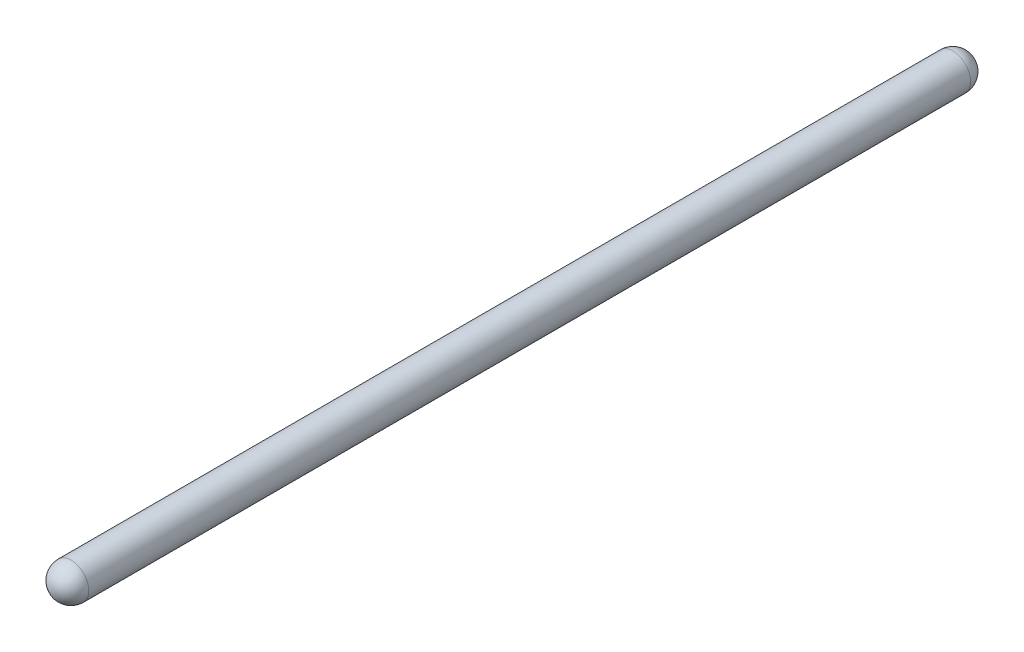
ISO-10303-21;
HEADER;
FILE_DESCRIPTION(('STEP AP214'),'2;1');
FILE_NAME('part.step','',(''),(''),'','','');
FILE_SCHEMA(('AUTOMOTIVE_DESIGN { 1 0 10303 214 1 1 1 1 }'));
ENDSEC;
DATA;
#1=APPLICATION_CONTEXT('core data for automotive mechanical design processes');
#2=APPLICATION_PROTOCOL_DEFINITION('international standard','automotive_design',2000,#1);
#3=PRODUCT_CONTEXT('',#1,'mechanical');
#4=PRODUCT('Part','Part','',(#3));
#5=PRODUCT_RELATED_PRODUCT_CATEGORY('part','',(#4));
#6=PRODUCT_DEFINITION_FORMATION('','',#4);
#7=PRODUCT_DEFINITION_CONTEXT('part definition',#1,'design');
#8=PRODUCT_DEFINITION('design','',#6,#7);
#9=PRODUCT_DEFINITION_SHAPE('','',#8);
#10=(LENGTH_UNIT() NAMED_UNIT(*) SI_UNIT(.MILLI.,.METRE.));
#11=(NAMED_UNIT(*) PLANE_ANGLE_UNIT() SI_UNIT($,.RADIAN.));
#12=(NAMED_UNIT(*) SI_UNIT($,.STERADIAN.) SOLID_ANGLE_UNIT());
#13=UNCERTAINTY_MEASURE_WITH_UNIT(LENGTH_MEASURE(1.E-05),#10,'distance_accuracy_value','');
#14=(GEOMETRIC_REPRESENTATION_CONTEXT(3) GLOBAL_UNCERTAINTY_ASSIGNED_CONTEXT((#13)) GLOBAL_UNIT_ASSIGNED_CONTEXT((#10,
#11,#12)) REPRESENTATION_CONTEXT('',''));
#15=CARTESIAN_POINT('',(0.,0.,0.));
#16=DIRECTION('',(0.,0.,1.));
#17=DIRECTION('',(1.,0.,0.));
#18=AXIS2_PLACEMENT_3D('',#15,#16,#17);
#19=CARTESIAN_POINT('',(0.,0.,310.));
#20=DIRECTION('',(0.,0.,-1.));
#21=DIRECTION('',(-1.,0.,0.));
#22=AXIS2_PLACEMENT_3D('',#19,#20,#21);
#23=CYLINDRICAL_SURFACE('',#22,6.);
#24=CARTESIAN_POINT('',(0.,0.,6.00000000000001));
#25=DIRECTION('',(0.,0.,-1.));
#26=DIRECTION('',(-1.,0.,0.));
#27=AXIS2_PLACEMENT_3D('',#24,#25,#26);
#28=CIRCLE('',#27,6.);
#29=CARTESIAN_POINT('',(-6.,0.,6.00000000000001));
#30=VERTEX_POINT('',#29);
#31=EDGE_CURVE('E10',#30,#30,#28,.F.);
#32=ORIENTED_EDGE('',*,*,#31,.T.);
#33=EDGE_LOOP('',(#32));
#34=FACE_BOUND('',#33,.T.);
#35=CARTESIAN_POINT('',(0.,0.,304.));
#36=DIRECTION('',(0.,0.,-1.));
#37=DIRECTION('',(-1.,0.,0.));
#38=AXIS2_PLACEMENT_3D('',#35,#36,#37);
#39=CIRCLE('',#38,6.);
#40=CARTESIAN_POINT('',(-6.,0.,304.));
#41=VERTEX_POINT('',#40);
#42=EDGE_CURVE('E45',#41,#41,#39,.T.);
#43=ORIENTED_EDGE('',*,*,#42,.T.);
#44=EDGE_LOOP('',(#43));
#45=FACE_BOUND('',#44,.T.);
#46=ADVANCED_FACE('F37',(#34,#45),#23,.T.);
#47=CARTESIAN_POINT('',(0.,0.,304.));
#48=DIRECTION('',(0.,0.,1.));
#49=DIRECTION('',(1.,0.,0.));
#50=AXIS2_PLACEMENT_3D('',#47,#48,#49);
#51=SPHERICAL_SURFACE('',#50,6.);
#52=ORIENTED_EDGE('',*,*,#42,.F.);
#53=EDGE_LOOP('',(#52));
#54=FACE_BOUND('',#53,.T.);
#55=ADVANCED_FACE('F53',(#54),#51,.T.);
#56=CARTESIAN_POINT('',(0.,0.,6.00000000000001));
#57=DIRECTION('',(0.,0.,1.));
#58=DIRECTION('',(1.,0.,0.));
#59=AXIS2_PLACEMENT_3D('',#56,#57,#58);
#60=SPHERICAL_SURFACE('',#59,6.);
#61=ORIENTED_EDGE('',*,*,#31,.F.);
#62=EDGE_LOOP('',(#61));
#63=FACE_BOUND('',#62,.T.);
#64=ADVANCED_FACE('F39',(#63),#60,.T.);
#65=CLOSED_SHELL('',(#46,#55,#64));
#66=MANIFOLD_SOLID_BREP('B2',#65);
#67=ADVANCED_BREP_SHAPE_REPRESENTATION('',(#18,#66),#14);
#68=SHAPE_DEFINITION_REPRESENTATION(#9,#67);
ENDSEC;
END-ISO-10303-21;
